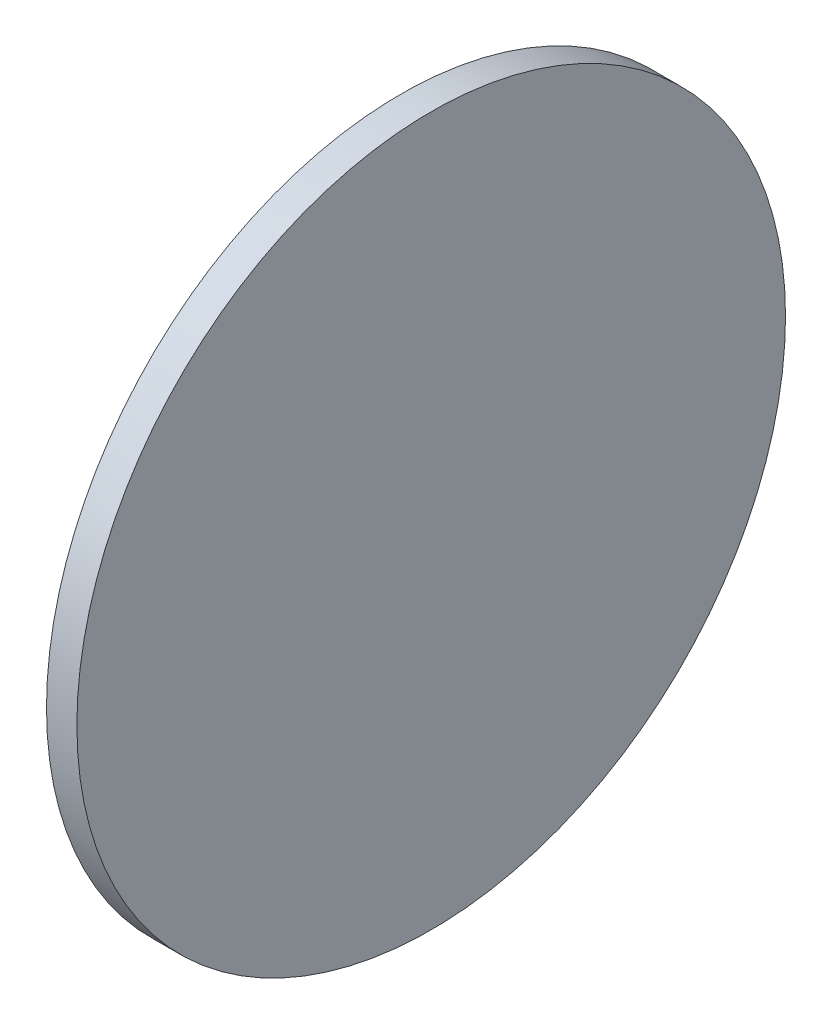
ISO-10303-21;
HEADER;
FILE_DESCRIPTION(('STEP AP214'),'2;1');
FILE_NAME('part.step','',(''),(''),'','','');
FILE_SCHEMA(('AUTOMOTIVE_DESIGN { 1 0 10303 214 1 1 1 1 }'));
ENDSEC;
DATA;
#1=APPLICATION_CONTEXT('core data for automotive mechanical design processes');
#2=APPLICATION_PROTOCOL_DEFINITION('international standard','automotive_design',2000,#1);
#3=PRODUCT_CONTEXT('',#1,'mechanical');
#4=PRODUCT('Part','Part','',(#3));
#5=PRODUCT_RELATED_PRODUCT_CATEGORY('part','',(#4));
#6=PRODUCT_DEFINITION_FORMATION('','',#4);
#7=PRODUCT_DEFINITION_CONTEXT('part definition',#1,'design');
#8=PRODUCT_DEFINITION('design','',#6,#7);
#9=PRODUCT_DEFINITION_SHAPE('','',#8);
#10=(LENGTH_UNIT() NAMED_UNIT(*) SI_UNIT(.MILLI.,.METRE.));
#11=(NAMED_UNIT(*) PLANE_ANGLE_UNIT() SI_UNIT($,.RADIAN.));
#12=(NAMED_UNIT(*) SI_UNIT($,.STERADIAN.) SOLID_ANGLE_UNIT());
#13=UNCERTAINTY_MEASURE_WITH_UNIT(LENGTH_MEASURE(1.E-05),#10,'distance_accuracy_value','');
#14=(GEOMETRIC_REPRESENTATION_CONTEXT(3) GLOBAL_UNCERTAINTY_ASSIGNED_CONTEXT((#13)) GLOBAL_UNIT_ASSIGNED_CONTEXT((#10,
#11,#12)) REPRESENTATION_CONTEXT('',''));
#15=CARTESIAN_POINT('',(0.,0.,0.));
#16=DIRECTION('',(0.,0.,1.));
#17=DIRECTION('',(1.,0.,0.));
#18=AXIS2_PLACEMENT_3D('',#15,#16,#17);
#19=CARTESIAN_POINT('',(6.35,0.,0.));
#20=DIRECTION('',(-1.,0.,0.));
#21=DIRECTION('',(0.,0.,1.));
#22=AXIS2_PLACEMENT_3D('',#19,#20,#21);
#23=CYLINDRICAL_SURFACE('',#22,74.041);
#24=CARTESIAN_POINT('',(6.35,0.,0.));
#25=DIRECTION('',(1.,0.,0.));
#26=DIRECTION('',(0.,0.,-1.));
#27=AXIS2_PLACEMENT_3D('',#24,#25,#26);
#28=CIRCLE('',#27,74.041);
#29=CARTESIAN_POINT('',(6.35,0.,-74.041));
#30=VERTEX_POINT('',#29);
#31=EDGE_CURVE('E10',#30,#30,#28,.T.);
#32=ORIENTED_EDGE('',*,*,#31,.F.);
#33=EDGE_LOOP('',(#32));
#34=FACE_BOUND('',#33,.T.);
#35=CARTESIAN_POINT('',(0.,0.,0.));
#36=DIRECTION('',(1.,0.,0.));
#37=DIRECTION('',(0.,0.,-1.));
#38=AXIS2_PLACEMENT_3D('',#35,#36,#37);
#39=CIRCLE('',#38,74.041);
#40=CARTESIAN_POINT('',(0.,0.,-74.041));
#41=VERTEX_POINT('',#40);
#42=EDGE_CURVE('E35',#41,#41,#39,.T.);
#43=ORIENTED_EDGE('',*,*,#42,.T.);
#44=EDGE_LOOP('',(#43));
#45=FACE_BOUND('',#44,.T.);
#46=ADVANCED_FACE('F32',(#34,#45),#23,.T.);
#47=CARTESIAN_POINT('',(6.35,0.,0.));
#48=DIRECTION('',(1.,0.,0.));
#49=DIRECTION('',(0.,0.,-1.));
#50=AXIS2_PLACEMENT_3D('',#47,#48,#49);
#51=PLANE('',#50);
#52=ORIENTED_EDGE('',*,*,#31,.T.);
#53=EDGE_LOOP('',(#52));
#54=FACE_BOUND('',#53,.T.);
#55=ADVANCED_FACE('F47',(#54),#51,.T.);
#56=CARTESIAN_POINT('',(0.,0.,0.));
#57=DIRECTION('',(1.,0.,0.));
#58=DIRECTION('',(0.,0.,-1.));
#59=AXIS2_PLACEMENT_3D('',#56,#57,#58);
#60=PLANE('',#59);
#61=ORIENTED_EDGE('',*,*,#42,.F.);
#62=EDGE_LOOP('',(#61));
#63=FACE_BOUND('',#62,.T.);
#64=ADVANCED_FACE('F45',(#63),#60,.F.);
#65=CLOSED_SHELL('',(#46,#55,#64));
#66=MANIFOLD_SOLID_BREP('B2',#65);
#67=ADVANCED_BREP_SHAPE_REPRESENTATION('',(#18,#66),#14);
#68=SHAPE_DEFINITION_REPRESENTATION(#9,#67);
ENDSEC;
END-ISO-10303-21;
